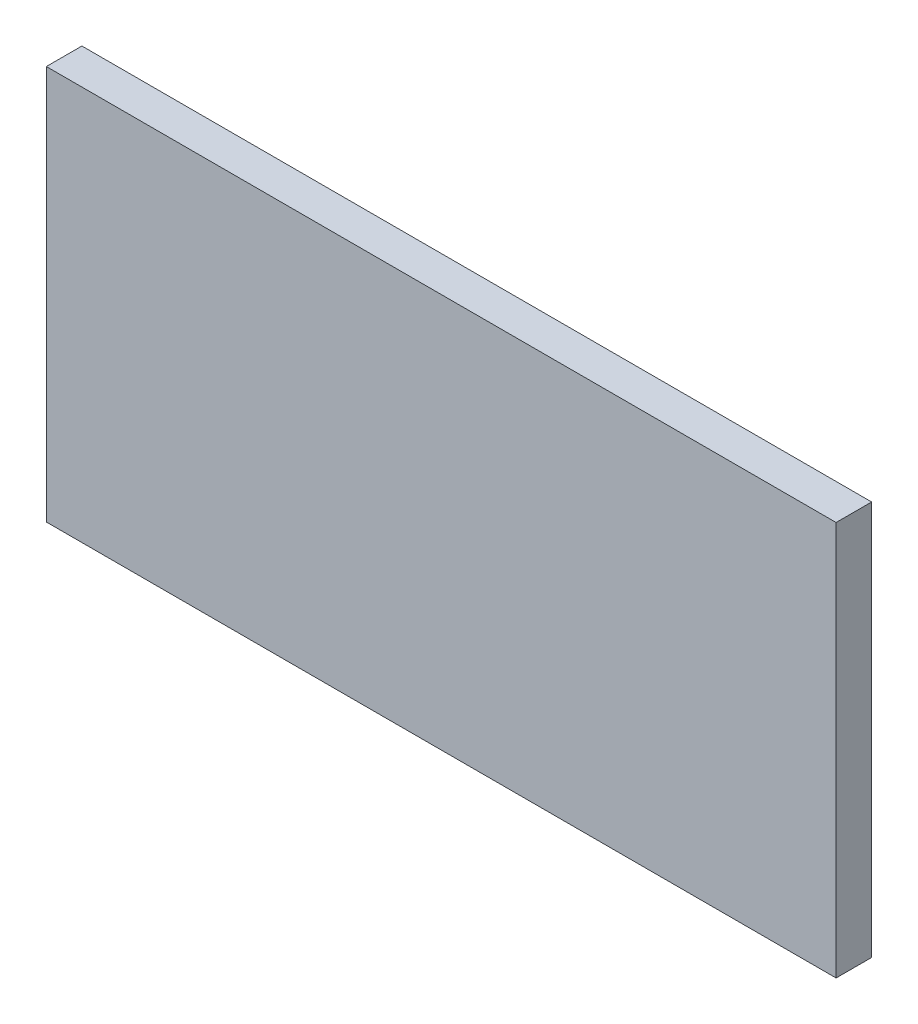
ISO-10303-21;
HEADER;
FILE_DESCRIPTION(('STEP AP214'),'2;1');
FILE_NAME('part.step','',(''),(''),'','','');
FILE_SCHEMA(('AUTOMOTIVE_DESIGN { 1 0 10303 214 1 1 1 1 }'));
ENDSEC;
DATA;
#1=APPLICATION_CONTEXT('core data for automotive mechanical design processes');
#2=APPLICATION_PROTOCOL_DEFINITION('international standard','automotive_design',2000,#1);
#3=PRODUCT_CONTEXT('',#1,'mechanical');
#4=PRODUCT('Part','Part','',(#3));
#5=PRODUCT_RELATED_PRODUCT_CATEGORY('part','',(#4));
#6=PRODUCT_DEFINITION_FORMATION('','',#4);
#7=PRODUCT_DEFINITION_CONTEXT('part definition',#1,'design');
#8=PRODUCT_DEFINITION('design','',#6,#7);
#9=PRODUCT_DEFINITION_SHAPE('','',#8);
#10=(LENGTH_UNIT() NAMED_UNIT(*) SI_UNIT(.MILLI.,.METRE.));
#11=(NAMED_UNIT(*) PLANE_ANGLE_UNIT() SI_UNIT($,.RADIAN.));
#12=(NAMED_UNIT(*) SI_UNIT($,.STERADIAN.) SOLID_ANGLE_UNIT());
#13=UNCERTAINTY_MEASURE_WITH_UNIT(LENGTH_MEASURE(1.E-05),#10,'distance_accuracy_value','');
#14=(GEOMETRIC_REPRESENTATION_CONTEXT(3) GLOBAL_UNCERTAINTY_ASSIGNED_CONTEXT((#13)) GLOBAL_UNIT_ASSIGNED_CONTEXT((#10,
#11,#12)) REPRESENTATION_CONTEXT('',''));
#15=CARTESIAN_POINT('',(0.,0.,0.));
#16=DIRECTION('',(0.,0.,1.));
#17=DIRECTION('',(1.,0.,0.));
#18=AXIS2_PLACEMENT_3D('',#15,#16,#17);
#19=CARTESIAN_POINT('',(4.16658136926,-10.4479672202503,21.9));
#20=DIRECTION('',(1.,0.,0.));
#21=DIRECTION('',(0.,0.,-1.));
#22=AXIS2_PLACEMENT_3D('',#19,#20,#21);
#23=PLANE('',#22);
#24=DIRECTION('',(0.,1.,0.));
#25=VECTOR('',#24,1.);
#26=CARTESIAN_POINT('',(4.16658136926,-10.4479672202503,22.9));
#27=LINE('',#26,#25);
#28=CARTESIAN_POINT('',(4.16658136926,-10.4479672202503,22.9));
#29=VERTEX_POINT('',#28);
#30=CARTESIAN_POINT('',(4.16658136926,0.652032779749696,22.9));
#31=VERTEX_POINT('',#30);
#32=EDGE_CURVE('E97',#29,#31,#27,.T.);
#33=ORIENTED_EDGE('',*,*,#32,.F.);
#34=DIRECTION('',(0.,0.,1.));
#35=VECTOR('',#34,1.);
#36=CARTESIAN_POINT('',(4.16658136926,-10.4479672202503,21.9));
#37=LINE('',#36,#35);
#38=CARTESIAN_POINT('',(4.16658136926,-10.4479672202503,21.9));
#39=VERTEX_POINT('',#38);
#40=EDGE_CURVE('E11',#39,#29,#37,.T.);
#41=ORIENTED_EDGE('',*,*,#40,.F.);
#42=DIRECTION('',(0.,1.,0.));
#43=VECTOR('',#42,1.);
#44=CARTESIAN_POINT('',(4.16658136926,-10.4479672202503,21.9));
#45=LINE('',#44,#43);
#46=CARTESIAN_POINT('',(4.16658136926,0.652032779749696,21.9));
#47=VERTEX_POINT('',#46);
#48=EDGE_CURVE('E92',#39,#47,#45,.T.);
#49=ORIENTED_EDGE('',*,*,#48,.T.);
#50=DIRECTION('',(0.,0.,1.));
#51=VECTOR('',#50,1.);
#52=CARTESIAN_POINT('',(4.16658136926,0.652032779749696,21.9));
#53=LINE('',#52,#51);
#54=EDGE_CURVE('E35',#47,#31,#53,.T.);
#55=ORIENTED_EDGE('',*,*,#54,.T.);
#56=EDGE_LOOP('',(#33,#41,#49,#55));
#57=FACE_BOUND('',#56,.T.);
#58=ADVANCED_FACE('F32',(#57),#23,.T.);
#59=CARTESIAN_POINT('',(4.16658136926,-10.4479672202503,21.9));
#60=DIRECTION('',(0.,1.,0.));
#61=DIRECTION('',(0.,0.,1.));
#62=AXIS2_PLACEMENT_3D('',#59,#60,#61);
#63=PLANE('',#62);
#64=DIRECTION('',(-1.,0.,0.));
#65=VECTOR('',#64,1.);
#66=CARTESIAN_POINT('',(4.16658136926,-10.4479672202503,22.9));
#67=LINE('',#66,#65);
#68=CARTESIAN_POINT('',(-18.0553807403288,-10.4479672202503,22.9));
#69=VERTEX_POINT('',#68);
#70=EDGE_CURVE('E65',#29,#69,#67,.T.);
#71=ORIENTED_EDGE('',*,*,#70,.T.);
#72=DIRECTION('',(0.,0.,1.));
#73=VECTOR('',#72,1.);
#74=CARTESIAN_POINT('',(-18.0553807403288,-10.4479672202503,21.9));
#75=LINE('',#74,#73);
#76=CARTESIAN_POINT('',(-18.0553807403288,-10.4479672202503,21.9));
#77=VERTEX_POINT('',#76);
#78=EDGE_CURVE('E41',#77,#69,#75,.T.);
#79=ORIENTED_EDGE('',*,*,#78,.F.);
#80=DIRECTION('',(-1.,0.,0.));
#81=VECTOR('',#80,1.);
#82=CARTESIAN_POINT('',(4.16658136926,-10.4479672202503,21.9));
#83=LINE('',#82,#81);
#84=EDGE_CURVE('E82',#39,#77,#83,.T.);
#85=ORIENTED_EDGE('',*,*,#84,.F.);
#86=ORIENTED_EDGE('',*,*,#40,.T.);
#87=EDGE_LOOP('',(#71,#79,#85,#86));
#88=FACE_BOUND('',#87,.T.);
#89=ADVANCED_FACE('F107',(#88),#63,.F.);
#90=CARTESIAN_POINT('',(-18.0553807403288,-10.4479672202503,21.9));
#91=DIRECTION('',(1.,0.,0.));
#92=DIRECTION('',(0.,0.,-1.));
#93=AXIS2_PLACEMENT_3D('',#90,#91,#92);
#94=PLANE('',#93);
#95=DIRECTION('',(0.,1.,0.));
#96=VECTOR('',#95,1.);
#97=CARTESIAN_POINT('',(-18.0553807403288,-10.4479672202503,22.9));
#98=LINE('',#97,#96);
#99=CARTESIAN_POINT('',(-18.0553807403288,0.652032779749696,22.9));
#100=VERTEX_POINT('',#99);
#101=EDGE_CURVE('E89',#69,#100,#98,.T.);
#102=ORIENTED_EDGE('',*,*,#101,.T.);
#103=DIRECTION('',(0.,0.,1.));
#104=VECTOR('',#103,1.);
#105=CARTESIAN_POINT('',(-18.0553807403288,0.652032779749696,21.9));
#106=LINE('',#105,#104);
#107=CARTESIAN_POINT('',(-18.0553807403288,0.652032779749696,21.9));
#108=VERTEX_POINT('',#107);
#109=EDGE_CURVE('E86',#108,#100,#106,.T.);
#110=ORIENTED_EDGE('',*,*,#109,.F.);
#111=DIRECTION('',(0.,1.,0.));
#112=VECTOR('',#111,1.);
#113=CARTESIAN_POINT('',(-18.0553807403288,-10.4479672202503,21.9));
#114=LINE('',#113,#112);
#115=EDGE_CURVE('E77',#77,#108,#114,.T.);
#116=ORIENTED_EDGE('',*,*,#115,.F.);
#117=ORIENTED_EDGE('',*,*,#78,.T.);
#118=EDGE_LOOP('',(#102,#110,#116,#117));
#119=FACE_BOUND('',#118,.T.);
#120=ADVANCED_FACE('F87',(#119),#94,.F.);
#121=CARTESIAN_POINT('',(4.16658136926,0.652032779749696,21.9));
#122=DIRECTION('',(0.,1.,0.));
#123=DIRECTION('',(0.,0.,1.));
#124=AXIS2_PLACEMENT_3D('',#121,#122,#123);
#125=PLANE('',#124);
#126=DIRECTION('',(-1.,0.,0.));
#127=VECTOR('',#126,1.);
#128=CARTESIAN_POINT('',(4.16658136926,0.652032779749696,22.9));
#129=LINE('',#128,#127);
#130=EDGE_CURVE('E100',#31,#100,#129,.T.);
#131=ORIENTED_EDGE('',*,*,#130,.F.);
#132=ORIENTED_EDGE('',*,*,#54,.F.);
#133=DIRECTION('',(-1.,0.,0.));
#134=VECTOR('',#133,1.);
#135=CARTESIAN_POINT('',(4.16658136926,0.652032779749696,21.9));
#136=LINE('',#135,#134);
#137=EDGE_CURVE('E81',#47,#108,#136,.T.);
#138=ORIENTED_EDGE('',*,*,#137,.T.);
#139=ORIENTED_EDGE('',*,*,#109,.T.);
#140=EDGE_LOOP('',(#131,#132,#138,#139));
#141=FACE_BOUND('',#140,.T.);
#142=ADVANCED_FACE('F91',(#141),#125,.T.);
#143=CARTESIAN_POINT('',(0.,0.,21.9));
#144=DIRECTION('',(0.,0.,1.));
#145=DIRECTION('',(1.,0.,0.));
#146=AXIS2_PLACEMENT_3D('',#143,#144,#145);
#147=PLANE('',#146);
#148=ORIENTED_EDGE('',*,*,#48,.F.);
#149=ORIENTED_EDGE('',*,*,#84,.T.);
#150=ORIENTED_EDGE('',*,*,#115,.T.);
#151=ORIENTED_EDGE('',*,*,#137,.F.);
#152=EDGE_LOOP('',(#148,#149,#150,#151));
#153=FACE_BOUND('',#152,.T.);
#154=ADVANCED_FACE('F80',(#153),#147,.F.);
#155=CARTESIAN_POINT('',(0.,0.,22.9));
#156=DIRECTION('',(0.,0.,1.));
#157=DIRECTION('',(1.,0.,0.));
#158=AXIS2_PLACEMENT_3D('',#155,#156,#157);
#159=PLANE('',#158);
#160=ORIENTED_EDGE('',*,*,#32,.T.);
#161=ORIENTED_EDGE('',*,*,#130,.T.);
#162=ORIENTED_EDGE('',*,*,#101,.F.);
#163=ORIENTED_EDGE('',*,*,#70,.F.);
#164=EDGE_LOOP('',(#160,#161,#162,#163));
#165=FACE_BOUND('',#164,.T.);
#166=ADVANCED_FACE('F105',(#165),#159,.T.);
#167=CLOSED_SHELL('',(#58,#89,#120,#142,#154,#166));
#168=MANIFOLD_SOLID_BREP('B2',#167);
#169=ADVANCED_BREP_SHAPE_REPRESENTATION('',(#18,#168),#14);
#170=SHAPE_DEFINITION_REPRESENTATION(#9,#169);
ENDSEC;
END-ISO-10303-21;
